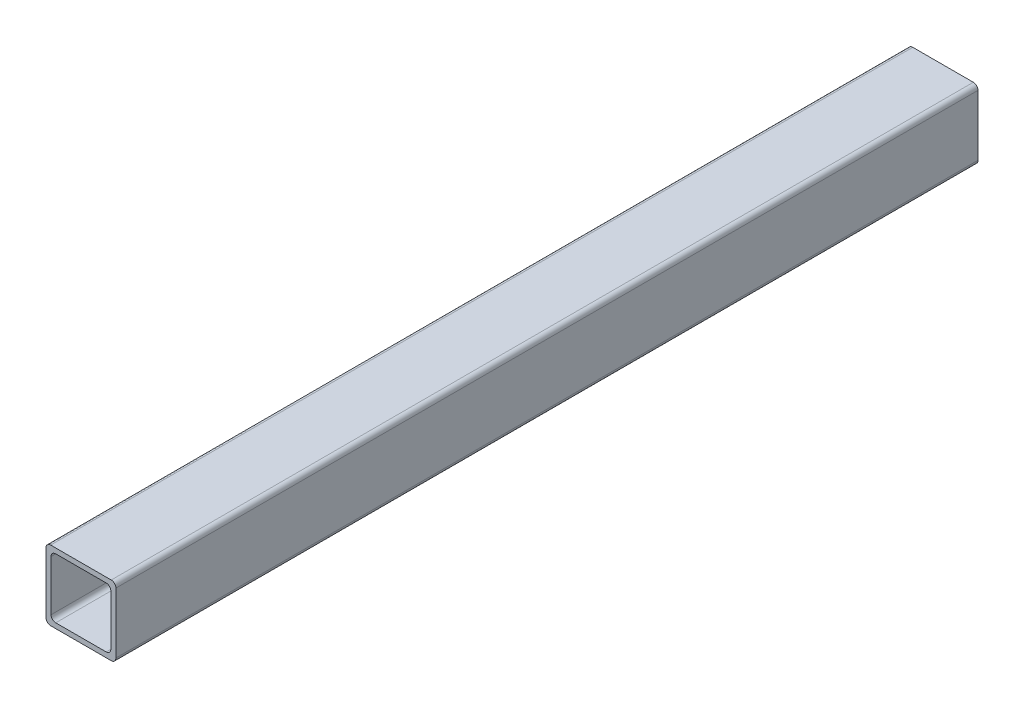
ISO-10303-21;
HEADER;
FILE_DESCRIPTION(('STEP AP214'),'2;1');
FILE_NAME('part.step','',(''),(''),'','','');
FILE_SCHEMA(('AUTOMOTIVE_DESIGN { 1 0 10303 214 1 1 1 1 }'));
ENDSEC;
DATA;
#1=APPLICATION_CONTEXT('core data for automotive mechanical design processes');
#2=APPLICATION_PROTOCOL_DEFINITION('international standard','automotive_design',2000,#1);
#3=PRODUCT_CONTEXT('',#1,'mechanical');
#4=PRODUCT('Part','Part','',(#3));
#5=PRODUCT_RELATED_PRODUCT_CATEGORY('part','',(#4));
#6=PRODUCT_DEFINITION_FORMATION('','',#4);
#7=PRODUCT_DEFINITION_CONTEXT('part definition',#1,'design');
#8=PRODUCT_DEFINITION('design','',#6,#7);
#9=PRODUCT_DEFINITION_SHAPE('','',#8);
#10=(LENGTH_UNIT() NAMED_UNIT(*) SI_UNIT(.MILLI.,.METRE.));
#11=(NAMED_UNIT(*) PLANE_ANGLE_UNIT() SI_UNIT($,.RADIAN.));
#12=(NAMED_UNIT(*) SI_UNIT($,.STERADIAN.) SOLID_ANGLE_UNIT());
#13=UNCERTAINTY_MEASURE_WITH_UNIT(LENGTH_MEASURE(1.E-05),#10,'distance_accuracy_value','');
#14=(GEOMETRIC_REPRESENTATION_CONTEXT(3) GLOBAL_UNCERTAINTY_ASSIGNED_CONTEXT((#13)) GLOBAL_UNIT_ASSIGNED_CONTEXT((#10,
#11,#12)) REPRESENTATION_CONTEXT('',''));
#15=CARTESIAN_POINT('',(0.,0.,0.));
#16=DIRECTION('',(0.,0.,1.));
#17=DIRECTION('',(1.,0.,0.));
#18=AXIS2_PLACEMENT_3D('',#15,#16,#17);
#19=CARTESIAN_POINT('',(2.54,-35.56,470.));
#20=DIRECTION('',(0.,0.,1.));
#21=DIRECTION('',(1.,0.,0.));
#22=AXIS2_PLACEMENT_3D('',#19,#20,#21);
#23=PLANE('',#22);
#24=CARTESIAN_POINT('',(2.54,-35.56,470.));
#25=DIRECTION('',(0.,0.,1.));
#26=DIRECTION('',(1.,0.,0.));
#27=AXIS2_PLACEMENT_3D('',#24,#25,#26);
#28=CIRCLE('',#27,2.54);
#29=CARTESIAN_POINT('',(0.,-35.56,470.));
#30=VERTEX_POINT('',#29);
#31=CARTESIAN_POINT('',(2.54000000000002,-38.1,470.));
#32=VERTEX_POINT('',#31);
#33=EDGE_CURVE('E211',#30,#32,#28,.T.);
#34=ORIENTED_EDGE('',*,*,#33,.T.);
#35=DIRECTION('',(1.,0.,0.));
#36=VECTOR('',#35,1.);
#37=CARTESIAN_POINT('',(2.54000000000002,-38.1,470.));
#38=LINE('',#37,#36);
#39=CARTESIAN_POINT('',(35.56,-38.1,470.));
#40=VERTEX_POINT('',#39);
#41=EDGE_CURVE('E214',#32,#40,#38,.T.);
#42=ORIENTED_EDGE('',*,*,#41,.T.);
#43=CARTESIAN_POINT('',(35.56,-35.56,470.));
#44=DIRECTION('',(0.,0.,1.));
#45=DIRECTION('',(-1.,0.,0.));
#46=AXIS2_PLACEMENT_3D('',#43,#44,#45);
#47=CIRCLE('',#46,2.54);
#48=CARTESIAN_POINT('',(38.1,-35.56,470.));
#49=VERTEX_POINT('',#48);
#50=EDGE_CURVE('E217',#40,#49,#47,.T.);
#51=ORIENTED_EDGE('',*,*,#50,.T.);
#52=DIRECTION('',(0.,1.,0.));
#53=VECTOR('',#52,1.);
#54=CARTESIAN_POINT('',(38.1,-2.54000000000002,470.));
#55=LINE('',#54,#53);
#56=CARTESIAN_POINT('',(38.1,-2.54000000000002,470.));
#57=VERTEX_POINT('',#56);
#58=EDGE_CURVE('E219',#49,#57,#55,.T.);
#59=ORIENTED_EDGE('',*,*,#58,.T.);
#60=CARTESIAN_POINT('',(35.56,-2.54,470.));
#61=DIRECTION('',(0.,0.,1.));
#62=DIRECTION('',(1.,0.,0.));
#63=AXIS2_PLACEMENT_3D('',#60,#61,#62);
#64=CIRCLE('',#63,2.54);
#65=CARTESIAN_POINT('',(35.56,0.,470.));
#66=VERTEX_POINT('',#65);
#67=EDGE_CURVE('E221',#57,#66,#64,.T.);
#68=ORIENTED_EDGE('',*,*,#67,.T.);
#69=DIRECTION('',(-1.,0.,0.));
#70=VECTOR('',#69,1.);
#71=CARTESIAN_POINT('',(2.54000000000002,0.,470.));
#72=LINE('',#71,#70);
#73=CARTESIAN_POINT('',(2.54000000000002,0.,470.));
#74=VERTEX_POINT('',#73);
#75=EDGE_CURVE('E223',#66,#74,#72,.T.);
#76=ORIENTED_EDGE('',*,*,#75,.T.);
#77=CARTESIAN_POINT('',(2.54,-2.54,470.));
#78=DIRECTION('',(0.,0.,1.));
#79=DIRECTION('',(-1.,0.,0.));
#80=AXIS2_PLACEMENT_3D('',#77,#78,#79);
#81=CIRCLE('',#80,2.54);
#82=CARTESIAN_POINT('',(0.,-2.54000000000002,470.));
#83=VERTEX_POINT('',#82);
#84=EDGE_CURVE('E225',#74,#83,#81,.T.);
#85=ORIENTED_EDGE('',*,*,#84,.T.);
#86=DIRECTION('',(0.,-1.,0.));
#87=VECTOR('',#86,1.);
#88=CARTESIAN_POINT('',(0.,-2.54000000000002,470.));
#89=LINE('',#88,#87);
#90=EDGE_CURVE('E227',#83,#30,#89,.T.);
#91=ORIENTED_EDGE('',*,*,#90,.T.);
#92=EDGE_LOOP('',(#34,#42,#51,#59,#68,#76,#85,#91));
#93=FACE_BOUND('',#92,.T.);
#94=DIRECTION('',(1.,0.,0.));
#95=VECTOR('',#94,1.);
#96=CARTESIAN_POINT('',(5.30860000000002,-35.3314,470.));
#97=LINE('',#96,#95);
#98=CARTESIAN_POINT('',(5.30860000000002,-35.3314,470.));
#99=VERTEX_POINT('',#98);
#100=CARTESIAN_POINT('',(32.7914,-35.3314,470.));
#101=VERTEX_POINT('',#100);
#102=EDGE_CURVE('E154',#99,#101,#97,.T.);
#103=ORIENTED_EDGE('',*,*,#102,.F.);
#104=CARTESIAN_POINT('',(5.3086,-32.7914,470.));
#105=DIRECTION('',(0.,0.,1.));
#106=DIRECTION('',(1.,0.,0.));
#107=AXIS2_PLACEMENT_3D('',#104,#105,#106);
#108=CIRCLE('',#107,2.54);
#109=CARTESIAN_POINT('',(2.7686,-32.7914,470.));
#110=VERTEX_POINT('',#109);
#111=EDGE_CURVE('E146',#110,#99,#108,.T.);
#112=ORIENTED_EDGE('',*,*,#111,.F.);
#113=DIRECTION('',(0.,-1.,0.));
#114=VECTOR('',#113,1.);
#115=CARTESIAN_POINT('',(2.7686,-5.30860000000002,470.));
#116=LINE('',#115,#114);
#117=CARTESIAN_POINT('',(2.7686,-5.30860000000002,470.));
#118=VERTEX_POINT('',#117);
#119=EDGE_CURVE('E179',#118,#110,#116,.T.);
#120=ORIENTED_EDGE('',*,*,#119,.F.);
#121=CARTESIAN_POINT('',(5.3086,-5.3086,470.));
#122=DIRECTION('',(0.,0.,1.));
#123=DIRECTION('',(1.,0.,0.));
#124=AXIS2_PLACEMENT_3D('',#121,#122,#123);
#125=CIRCLE('',#124,2.54);
#126=CARTESIAN_POINT('',(5.30860000000002,-2.7686,470.));
#127=VERTEX_POINT('',#126);
#128=EDGE_CURVE('E177',#127,#118,#125,.T.);
#129=ORIENTED_EDGE('',*,*,#128,.F.);
#130=DIRECTION('',(-1.,0.,0.));
#131=VECTOR('',#130,1.);
#132=CARTESIAN_POINT('',(5.30860000000002,-2.7686,470.));
#133=LINE('',#132,#131);
#134=CARTESIAN_POINT('',(32.7914,-2.7686,470.));
#135=VERTEX_POINT('',#134);
#136=EDGE_CURVE('E175',#135,#127,#133,.T.);
#137=ORIENTED_EDGE('',*,*,#136,.F.);
#138=CARTESIAN_POINT('',(32.7914,-5.3086,470.));
#139=DIRECTION('',(0.,0.,1.));
#140=DIRECTION('',(1.,0.,0.));
#141=AXIS2_PLACEMENT_3D('',#138,#139,#140);
#142=CIRCLE('',#141,2.54);
#143=CARTESIAN_POINT('',(35.3314,-5.30860000000002,470.));
#144=VERTEX_POINT('',#143);
#145=EDGE_CURVE('E173',#144,#135,#142,.T.);
#146=ORIENTED_EDGE('',*,*,#145,.F.);
#147=DIRECTION('',(0.,1.,0.));
#148=VECTOR('',#147,1.);
#149=CARTESIAN_POINT('',(35.3314,-5.30860000000002,470.));
#150=LINE('',#149,#148);
#151=CARTESIAN_POINT('',(35.3314,-32.7914,470.));
#152=VERTEX_POINT('',#151);
#153=EDGE_CURVE('E169',#152,#144,#150,.T.);
#154=ORIENTED_EDGE('',*,*,#153,.F.);
#155=CARTESIAN_POINT('',(32.7914,-32.7914,470.));
#156=DIRECTION('',(0.,0.,1.));
#157=DIRECTION('',(1.,0.,0.));
#158=AXIS2_PLACEMENT_3D('',#155,#156,#157);
#159=CIRCLE('',#158,2.54);
#160=EDGE_CURVE('E167',#101,#152,#159,.T.);
#161=ORIENTED_EDGE('',*,*,#160,.F.);
#162=EDGE_LOOP('',(#103,#112,#120,#129,#137,#146,#154,#161));
#163=FACE_BOUND('',#162,.T.);
#164=ADVANCED_FACE('F33',(#93,#163),#23,.T.);
#165=CARTESIAN_POINT('',(2.54,-35.56,0.));
#166=DIRECTION('',(0.,0.,1.));
#167=DIRECTION('',(1.,0.,0.));
#168=AXIS2_PLACEMENT_3D('',#165,#166,#167);
#169=PLANE('',#168);
#170=CARTESIAN_POINT('',(2.54,-35.56,0.));
#171=DIRECTION('',(0.,0.,1.));
#172=DIRECTION('',(1.,0.,0.));
#173=AXIS2_PLACEMENT_3D('',#170,#171,#172);
#174=CIRCLE('',#173,2.54);
#175=CARTESIAN_POINT('',(0.,-35.56,0.));
#176=VERTEX_POINT('',#175);
#177=CARTESIAN_POINT('',(2.54000000000002,-38.1,0.));
#178=VERTEX_POINT('',#177);
#179=EDGE_CURVE('E162',#176,#178,#174,.T.);
#180=ORIENTED_EDGE('',*,*,#179,.F.);
#181=DIRECTION('',(0.,-1.,0.));
#182=VECTOR('',#181,1.);
#183=CARTESIAN_POINT('',(0.,-2.54000000000002,0.));
#184=LINE('',#183,#182);
#185=CARTESIAN_POINT('',(0.,-2.54000000000002,0.));
#186=VERTEX_POINT('',#185);
#187=EDGE_CURVE('E215',#186,#176,#184,.T.);
#188=ORIENTED_EDGE('',*,*,#187,.F.);
#189=CARTESIAN_POINT('',(2.54,-2.54,0.));
#190=DIRECTION('',(0.,0.,1.));
#191=DIRECTION('',(-1.,0.,0.));
#192=AXIS2_PLACEMENT_3D('',#189,#190,#191);
#193=CIRCLE('',#192,2.54);
#194=CARTESIAN_POINT('',(2.54000000000002,0.,0.));
#195=VERTEX_POINT('',#194);
#196=EDGE_CURVE('E242',#195,#186,#193,.T.);
#197=ORIENTED_EDGE('',*,*,#196,.F.);
#198=DIRECTION('',(-1.,0.,0.));
#199=VECTOR('',#198,1.);
#200=CARTESIAN_POINT('',(2.54000000000002,0.,0.));
#201=LINE('',#200,#199);
#202=CARTESIAN_POINT('',(35.56,0.,0.));
#203=VERTEX_POINT('',#202);
#204=EDGE_CURVE('E240',#203,#195,#201,.T.);
#205=ORIENTED_EDGE('',*,*,#204,.F.);
#206=CARTESIAN_POINT('',(35.56,-2.54,0.));
#207=DIRECTION('',(0.,0.,1.));
#208=DIRECTION('',(1.,0.,0.));
#209=AXIS2_PLACEMENT_3D('',#206,#207,#208);
#210=CIRCLE('',#209,2.54);
#211=CARTESIAN_POINT('',(38.1,-2.54000000000002,0.));
#212=VERTEX_POINT('',#211);
#213=EDGE_CURVE('E238',#212,#203,#210,.T.);
#214=ORIENTED_EDGE('',*,*,#213,.F.);
#215=DIRECTION('',(0.,1.,0.));
#216=VECTOR('',#215,1.);
#217=CARTESIAN_POINT('',(38.1,-2.54000000000002,0.));
#218=LINE('',#217,#216);
#219=CARTESIAN_POINT('',(38.1,-35.56,0.));
#220=VERTEX_POINT('',#219);
#221=EDGE_CURVE('E236',#220,#212,#218,.T.);
#222=ORIENTED_EDGE('',*,*,#221,.F.);
#223=CARTESIAN_POINT('',(35.56,-35.56,0.));
#224=DIRECTION('',(0.,0.,1.));
#225=DIRECTION('',(-1.,0.,0.));
#226=AXIS2_PLACEMENT_3D('',#223,#224,#225);
#227=CIRCLE('',#226,2.54);
#228=CARTESIAN_POINT('',(35.56,-38.1,0.));
#229=VERTEX_POINT('',#228);
#230=EDGE_CURVE('E234',#229,#220,#227,.T.);
#231=ORIENTED_EDGE('',*,*,#230,.F.);
#232=DIRECTION('',(1.,0.,0.));
#233=VECTOR('',#232,1.);
#234=CARTESIAN_POINT('',(2.54000000000002,-38.1,0.));
#235=LINE('',#234,#233);
#236=EDGE_CURVE('E232',#178,#229,#235,.T.);
#237=ORIENTED_EDGE('',*,*,#236,.F.);
#238=EDGE_LOOP('',(#180,#188,#197,#205,#214,#222,#231,#237));
#239=FACE_BOUND('',#238,.T.);
#240=CARTESIAN_POINT('',(5.3086,-32.7914,0.));
#241=DIRECTION('',(0.,0.,1.));
#242=DIRECTION('',(1.,0.,0.));
#243=AXIS2_PLACEMENT_3D('',#240,#241,#242);
#244=CIRCLE('',#243,2.54);
#245=CARTESIAN_POINT('',(2.7686,-32.7914,0.));
#246=VERTEX_POINT('',#245);
#247=CARTESIAN_POINT('',(5.30860000000002,-35.3314,0.));
#248=VERTEX_POINT('',#247);
#249=EDGE_CURVE('E56',#246,#248,#244,.T.);
#250=ORIENTED_EDGE('',*,*,#249,.T.);
#251=DIRECTION('',(1.,0.,0.));
#252=VECTOR('',#251,1.);
#253=CARTESIAN_POINT('',(5.30860000000002,-35.3314,0.));
#254=LINE('',#253,#252);
#255=CARTESIAN_POINT('',(32.7914,-35.3314,0.));
#256=VERTEX_POINT('',#255);
#257=EDGE_CURVE('E161',#248,#256,#254,.T.);
#258=ORIENTED_EDGE('',*,*,#257,.T.);
#259=CARTESIAN_POINT('',(32.7914,-32.7914,0.));
#260=DIRECTION('',(0.,0.,1.));
#261=DIRECTION('',(1.,0.,0.));
#262=AXIS2_PLACEMENT_3D('',#259,#260,#261);
#263=CIRCLE('',#262,2.54);
#264=CARTESIAN_POINT('',(35.3314,-32.7914,0.));
#265=VERTEX_POINT('',#264);
#266=EDGE_CURVE('E183',#256,#265,#263,.T.);
#267=ORIENTED_EDGE('',*,*,#266,.T.);
#268=DIRECTION('',(0.,1.,0.));
#269=VECTOR('',#268,1.);
#270=CARTESIAN_POINT('',(35.3314,-5.30860000000002,0.));
#271=LINE('',#270,#269);
#272=CARTESIAN_POINT('',(35.3314,-5.30860000000002,0.));
#273=VERTEX_POINT('',#272);
#274=EDGE_CURVE('E186',#265,#273,#271,.T.);
#275=ORIENTED_EDGE('',*,*,#274,.T.);
#276=CARTESIAN_POINT('',(32.7914,-5.3086,0.));
#277=DIRECTION('',(0.,0.,1.));
#278=DIRECTION('',(1.,0.,0.));
#279=AXIS2_PLACEMENT_3D('',#276,#277,#278);
#280=CIRCLE('',#279,2.54);
#281=CARTESIAN_POINT('',(32.7914,-2.7686,0.));
#282=VERTEX_POINT('',#281);
#283=EDGE_CURVE('E189',#273,#282,#280,.T.);
#284=ORIENTED_EDGE('',*,*,#283,.T.);
#285=DIRECTION('',(-1.,0.,0.));
#286=VECTOR('',#285,1.);
#287=CARTESIAN_POINT('',(5.30860000000002,-2.7686,0.));
#288=LINE('',#287,#286);
#289=CARTESIAN_POINT('',(5.30860000000002,-2.7686,0.));
#290=VERTEX_POINT('',#289);
#291=EDGE_CURVE('E192',#282,#290,#288,.T.);
#292=ORIENTED_EDGE('',*,*,#291,.T.);
#293=CARTESIAN_POINT('',(5.3086,-5.3086,0.));
#294=DIRECTION('',(0.,0.,1.));
#295=DIRECTION('',(1.,0.,0.));
#296=AXIS2_PLACEMENT_3D('',#293,#294,#295);
#297=CIRCLE('',#296,2.54);
#298=CARTESIAN_POINT('',(2.7686,-5.30860000000002,0.));
#299=VERTEX_POINT('',#298);
#300=EDGE_CURVE('E195',#290,#299,#297,.T.);
#301=ORIENTED_EDGE('',*,*,#300,.T.);
#302=DIRECTION('',(0.,-1.,0.));
#303=VECTOR('',#302,1.);
#304=CARTESIAN_POINT('',(2.7686,-5.30860000000002,0.));
#305=LINE('',#304,#303);
#306=EDGE_CURVE('E155',#299,#246,#305,.T.);
#307=ORIENTED_EDGE('',*,*,#306,.T.);
#308=EDGE_LOOP('',(#250,#258,#267,#275,#284,#292,#301,#307));
#309=FACE_BOUND('',#308,.T.);
#310=ADVANCED_FACE('F272',(#239,#309),#169,.F.);
#311=CARTESIAN_POINT('',(2.54,-35.56,470.));
#312=DIRECTION('',(0.,0.,-1.));
#313=DIRECTION('',(-1.,0.,0.));
#314=AXIS2_PLACEMENT_3D('',#311,#312,#313);
#315=CYLINDRICAL_SURFACE('',#314,2.54);
#316=ORIENTED_EDGE('',*,*,#179,.T.);
#317=DIRECTION('',(0.,0.,-1.));
#318=VECTOR('',#317,1.);
#319=CARTESIAN_POINT('',(2.54000000000002,-38.1,470.));
#320=LINE('',#319,#318);
#321=EDGE_CURVE('E11',#32,#178,#320,.T.);
#322=ORIENTED_EDGE('',*,*,#321,.F.);
#323=ORIENTED_EDGE('',*,*,#33,.F.);
#324=DIRECTION('',(0.,0.,-1.));
#325=VECTOR('',#324,1.);
#326=CARTESIAN_POINT('',(0.,-35.56,470.));
#327=LINE('',#326,#325);
#328=EDGE_CURVE('E229',#30,#176,#327,.T.);
#329=ORIENTED_EDGE('',*,*,#328,.T.);
#330=EDGE_LOOP('',(#316,#322,#323,#329));
#331=FACE_BOUND('',#330,.T.);
#332=ADVANCED_FACE('F35',(#331),#315,.T.);
#333=CARTESIAN_POINT('',(2.54000000000002,-38.1,470.));
#334=DIRECTION('',(0.,1.,0.));
#335=DIRECTION('',(0.,0.,1.));
#336=AXIS2_PLACEMENT_3D('',#333,#334,#335);
#337=PLANE('',#336);
#338=ORIENTED_EDGE('',*,*,#236,.T.);
#339=DIRECTION('',(0.,0.,-1.));
#340=VECTOR('',#339,1.);
#341=CARTESIAN_POINT('',(35.56,-38.1,470.));
#342=LINE('',#341,#340);
#343=EDGE_CURVE('E41',#40,#229,#342,.T.);
#344=ORIENTED_EDGE('',*,*,#343,.F.);
#345=ORIENTED_EDGE('',*,*,#41,.F.);
#346=ORIENTED_EDGE('',*,*,#321,.T.);
#347=EDGE_LOOP('',(#338,#344,#345,#346));
#348=FACE_BOUND('',#347,.T.);
#349=ADVANCED_FACE('F289',(#348),#337,.F.);
#350=CARTESIAN_POINT('',(35.56,-35.56,470.));
#351=DIRECTION('',(0.,0.,-1.));
#352=DIRECTION('',(-1.,0.,0.));
#353=AXIS2_PLACEMENT_3D('',#350,#351,#352);
#354=CYLINDRICAL_SURFACE('',#353,2.54);
#355=ORIENTED_EDGE('',*,*,#230,.T.);
#356=DIRECTION('',(0.,0.,-1.));
#357=VECTOR('',#356,1.);
#358=CARTESIAN_POINT('',(38.1,-35.56,470.));
#359=LINE('',#358,#357);
#360=EDGE_CURVE('E259',#49,#220,#359,.T.);
#361=ORIENTED_EDGE('',*,*,#360,.F.);
#362=ORIENTED_EDGE('',*,*,#50,.F.);
#363=ORIENTED_EDGE('',*,*,#343,.T.);
#364=EDGE_LOOP('',(#355,#361,#362,#363));
#365=FACE_BOUND('',#364,.T.);
#366=ADVANCED_FACE('F266',(#365),#354,.T.);
#367=CARTESIAN_POINT('',(38.1,-2.54000000000002,470.));
#368=DIRECTION('',(-1.,0.,0.));
#369=DIRECTION('',(0.,-1.,0.));
#370=AXIS2_PLACEMENT_3D('',#367,#368,#369);
#371=PLANE('',#370);
#372=ORIENTED_EDGE('',*,*,#221,.T.);
#373=DIRECTION('',(0.,0.,-1.));
#374=VECTOR('',#373,1.);
#375=CARTESIAN_POINT('',(38.1,-2.54000000000002,470.));
#376=LINE('',#375,#374);
#377=EDGE_CURVE('E256',#57,#212,#376,.T.);
#378=ORIENTED_EDGE('',*,*,#377,.F.);
#379=ORIENTED_EDGE('',*,*,#58,.F.);
#380=ORIENTED_EDGE('',*,*,#360,.T.);
#381=EDGE_LOOP('',(#372,#378,#379,#380));
#382=FACE_BOUND('',#381,.T.);
#383=ADVANCED_FACE('F278',(#382),#371,.F.);
#384=CARTESIAN_POINT('',(35.56,-2.54,470.));
#385=DIRECTION('',(0.,0.,-1.));
#386=DIRECTION('',(-1.,0.,0.));
#387=AXIS2_PLACEMENT_3D('',#384,#385,#386);
#388=CYLINDRICAL_SURFACE('',#387,2.54);
#389=ORIENTED_EDGE('',*,*,#213,.T.);
#390=DIRECTION('',(0.,0.,-1.));
#391=VECTOR('',#390,1.);
#392=CARTESIAN_POINT('',(35.56,0.,470.));
#393=LINE('',#392,#391);
#394=EDGE_CURVE('E253',#66,#203,#393,.T.);
#395=ORIENTED_EDGE('',*,*,#394,.F.);
#396=ORIENTED_EDGE('',*,*,#67,.F.);
#397=ORIENTED_EDGE('',*,*,#377,.T.);
#398=EDGE_LOOP('',(#389,#395,#396,#397));
#399=FACE_BOUND('',#398,.T.);
#400=ADVANCED_FACE('F282',(#399),#388,.T.);
#401=CARTESIAN_POINT('',(2.54000000000002,0.,470.));
#402=DIRECTION('',(0.,-1.,0.));
#403=DIRECTION('',(0.,0.,-1.));
#404=AXIS2_PLACEMENT_3D('',#401,#402,#403);
#405=PLANE('',#404);
#406=ORIENTED_EDGE('',*,*,#204,.T.);
#407=DIRECTION('',(0.,0.,-1.));
#408=VECTOR('',#407,1.);
#409=CARTESIAN_POINT('',(2.54000000000002,0.,470.));
#410=LINE('',#409,#408);
#411=EDGE_CURVE('E250',#74,#195,#410,.T.);
#412=ORIENTED_EDGE('',*,*,#411,.F.);
#413=ORIENTED_EDGE('',*,*,#75,.F.);
#414=ORIENTED_EDGE('',*,*,#394,.T.);
#415=EDGE_LOOP('',(#406,#412,#413,#414));
#416=FACE_BOUND('',#415,.T.);
#417=ADVANCED_FACE('F302',(#416),#405,.F.);
#418=CARTESIAN_POINT('',(2.54,-2.54,470.));
#419=DIRECTION('',(0.,0.,-1.));
#420=DIRECTION('',(-1.,0.,0.));
#421=AXIS2_PLACEMENT_3D('',#418,#419,#420);
#422=CYLINDRICAL_SURFACE('',#421,2.54);
#423=ORIENTED_EDGE('',*,*,#196,.T.);
#424=DIRECTION('',(0.,0.,-1.));
#425=VECTOR('',#424,1.);
#426=CARTESIAN_POINT('',(0.,-2.54000000000002,470.));
#427=LINE('',#426,#425);
#428=EDGE_CURVE('E247',#83,#186,#427,.T.);
#429=ORIENTED_EDGE('',*,*,#428,.F.);
#430=ORIENTED_EDGE('',*,*,#84,.F.);
#431=ORIENTED_EDGE('',*,*,#411,.T.);
#432=EDGE_LOOP('',(#423,#429,#430,#431));
#433=FACE_BOUND('',#432,.T.);
#434=ADVANCED_FACE('F300',(#433),#422,.T.);
#435=CARTESIAN_POINT('',(0.,-2.54000000000002,470.));
#436=DIRECTION('',(1.,0.,0.));
#437=DIRECTION('',(0.,1.,0.));
#438=AXIS2_PLACEMENT_3D('',#435,#436,#437);
#439=PLANE('',#438);
#440=ORIENTED_EDGE('',*,*,#187,.T.);
#441=ORIENTED_EDGE('',*,*,#328,.F.);
#442=ORIENTED_EDGE('',*,*,#90,.F.);
#443=ORIENTED_EDGE('',*,*,#428,.T.);
#444=EDGE_LOOP('',(#440,#441,#442,#443));
#445=FACE_BOUND('',#444,.T.);
#446=ADVANCED_FACE('F295',(#445),#439,.F.);
#447=CARTESIAN_POINT('',(5.3086,-32.7914,470.));
#448=DIRECTION('',(0.,0.,-1.));
#449=DIRECTION('',(-1.,0.,0.));
#450=AXIS2_PLACEMENT_3D('',#447,#448,#449);
#451=CYLINDRICAL_SURFACE('',#450,2.54);
#452=ORIENTED_EDGE('',*,*,#249,.F.);
#453=DIRECTION('',(0.,0.,-1.));
#454=VECTOR('',#453,1.);
#455=CARTESIAN_POINT('',(2.7686,-32.7914,470.));
#456=LINE('',#455,#454);
#457=EDGE_CURVE('E150',#110,#246,#456,.T.);
#458=ORIENTED_EDGE('',*,*,#457,.F.);
#459=ORIENTED_EDGE('',*,*,#111,.T.);
#460=DIRECTION('',(0.,0.,-1.));
#461=VECTOR('',#460,1.);
#462=CARTESIAN_POINT('',(5.30860000000002,-35.3314,470.));
#463=LINE('',#462,#461);
#464=EDGE_CURVE('E149',#99,#248,#463,.T.);
#465=ORIENTED_EDGE('',*,*,#464,.T.);
#466=EDGE_LOOP('',(#452,#458,#459,#465));
#467=FACE_BOUND('',#466,.T.);
#468=ADVANCED_FACE('F148',(#467),#451,.F.);
#469=CARTESIAN_POINT('',(5.30860000000002,-35.3314,470.));
#470=DIRECTION('',(0.,1.,0.));
#471=DIRECTION('',(0.,0.,1.));
#472=AXIS2_PLACEMENT_3D('',#469,#470,#471);
#473=PLANE('',#472);
#474=ORIENTED_EDGE('',*,*,#257,.F.);
#475=ORIENTED_EDGE('',*,*,#464,.F.);
#476=ORIENTED_EDGE('',*,*,#102,.T.);
#477=DIRECTION('',(0.,0.,-1.));
#478=VECTOR('',#477,1.);
#479=CARTESIAN_POINT('',(32.7914,-35.3314,470.));
#480=LINE('',#479,#478);
#481=EDGE_CURVE('E163',#101,#256,#480,.T.);
#482=ORIENTED_EDGE('',*,*,#481,.T.);
#483=EDGE_LOOP('',(#474,#475,#476,#482));
#484=FACE_BOUND('',#483,.T.);
#485=ADVANCED_FACE('F158',(#484),#473,.T.);
#486=CARTESIAN_POINT('',(32.7914,-32.7914,470.));
#487=DIRECTION('',(0.,0.,-1.));
#488=DIRECTION('',(-1.,0.,0.));
#489=AXIS2_PLACEMENT_3D('',#486,#487,#488);
#490=CYLINDRICAL_SURFACE('',#489,2.54);
#491=ORIENTED_EDGE('',*,*,#266,.F.);
#492=ORIENTED_EDGE('',*,*,#481,.F.);
#493=ORIENTED_EDGE('',*,*,#160,.T.);
#494=DIRECTION('',(0.,0.,-1.));
#495=VECTOR('',#494,1.);
#496=CARTESIAN_POINT('',(35.3314,-32.7914,470.));
#497=LINE('',#496,#495);
#498=EDGE_CURVE('E208',#152,#265,#497,.T.);
#499=ORIENTED_EDGE('',*,*,#498,.T.);
#500=EDGE_LOOP('',(#491,#492,#493,#499));
#501=FACE_BOUND('',#500,.T.);
#502=ADVANCED_FACE('F327',(#501),#490,.F.);
#503=CARTESIAN_POINT('',(35.3314,-5.30860000000002,470.));
#504=DIRECTION('',(-1.,0.,0.));
#505=DIRECTION('',(0.,0.,1.));
#506=AXIS2_PLACEMENT_3D('',#503,#504,#505);
#507=PLANE('',#506);
#508=ORIENTED_EDGE('',*,*,#274,.F.);
#509=ORIENTED_EDGE('',*,*,#498,.F.);
#510=ORIENTED_EDGE('',*,*,#153,.T.);
#511=DIRECTION('',(0.,0.,-1.));
#512=VECTOR('',#511,1.);
#513=CARTESIAN_POINT('',(35.3314,-5.30860000000002,470.));
#514=LINE('',#513,#512);
#515=EDGE_CURVE('E206',#144,#273,#514,.T.);
#516=ORIENTED_EDGE('',*,*,#515,.T.);
#517=EDGE_LOOP('',(#508,#509,#510,#516));
#518=FACE_BOUND('',#517,.T.);
#519=ADVANCED_FACE('F331',(#518),#507,.T.);
#520=CARTESIAN_POINT('',(32.7914,-5.3086,470.));
#521=DIRECTION('',(0.,0.,-1.));
#522=DIRECTION('',(-1.,0.,0.));
#523=AXIS2_PLACEMENT_3D('',#520,#521,#522);
#524=CYLINDRICAL_SURFACE('',#523,2.54);
#525=ORIENTED_EDGE('',*,*,#283,.F.);
#526=ORIENTED_EDGE('',*,*,#515,.F.);
#527=ORIENTED_EDGE('',*,*,#145,.T.);
#528=DIRECTION('',(0.,0.,-1.));
#529=VECTOR('',#528,1.);
#530=CARTESIAN_POINT('',(32.7914,-2.7686,470.));
#531=LINE('',#530,#529);
#532=EDGE_CURVE('E204',#135,#282,#531,.T.);
#533=ORIENTED_EDGE('',*,*,#532,.T.);
#534=EDGE_LOOP('',(#525,#526,#527,#533));
#535=FACE_BOUND('',#534,.T.);
#536=ADVANCED_FACE('F337',(#535),#524,.F.);
#537=CARTESIAN_POINT('',(5.30860000000002,-2.7686,470.));
#538=DIRECTION('',(0.,-1.,0.));
#539=DIRECTION('',(0.,0.,-1.));
#540=AXIS2_PLACEMENT_3D('',#537,#538,#539);
#541=PLANE('',#540);
#542=ORIENTED_EDGE('',*,*,#291,.F.);
#543=ORIENTED_EDGE('',*,*,#532,.F.);
#544=ORIENTED_EDGE('',*,*,#136,.T.);
#545=DIRECTION('',(0.,0.,-1.));
#546=VECTOR('',#545,1.);
#547=CARTESIAN_POINT('',(5.30860000000002,-2.7686,470.));
#548=LINE('',#547,#546);
#549=EDGE_CURVE('E202',#127,#290,#548,.T.);
#550=ORIENTED_EDGE('',*,*,#549,.T.);
#551=EDGE_LOOP('',(#542,#543,#544,#550));
#552=FACE_BOUND('',#551,.T.);
#553=ADVANCED_FACE('F341',(#552),#541,.T.);
#554=CARTESIAN_POINT('',(5.3086,-5.3086,470.));
#555=DIRECTION('',(0.,0.,-1.));
#556=DIRECTION('',(-1.,0.,0.));
#557=AXIS2_PLACEMENT_3D('',#554,#555,#556);
#558=CYLINDRICAL_SURFACE('',#557,2.54);
#559=ORIENTED_EDGE('',*,*,#300,.F.);
#560=ORIENTED_EDGE('',*,*,#549,.F.);
#561=ORIENTED_EDGE('',*,*,#128,.T.);
#562=DIRECTION('',(0.,0.,-1.));
#563=VECTOR('',#562,1.);
#564=CARTESIAN_POINT('',(2.7686,-5.30860000000002,470.));
#565=LINE('',#564,#563);
#566=EDGE_CURVE('E48',#118,#299,#565,.T.);
#567=ORIENTED_EDGE('',*,*,#566,.T.);
#568=EDGE_LOOP('',(#559,#560,#561,#567));
#569=FACE_BOUND('',#568,.T.);
#570=ADVANCED_FACE('F345',(#569),#558,.F.);
#571=CARTESIAN_POINT('',(2.7686,-5.30860000000002,470.));
#572=DIRECTION('',(1.,0.,0.));
#573=DIRECTION('',(0.,0.,-1.));
#574=AXIS2_PLACEMENT_3D('',#571,#572,#573);
#575=PLANE('',#574);
#576=ORIENTED_EDGE('',*,*,#306,.F.);
#577=ORIENTED_EDGE('',*,*,#566,.F.);
#578=ORIENTED_EDGE('',*,*,#119,.T.);
#579=ORIENTED_EDGE('',*,*,#457,.T.);
#580=EDGE_LOOP('',(#576,#577,#578,#579));
#581=FACE_BOUND('',#580,.T.);
#582=ADVANCED_FACE('F349',(#581),#575,.T.);
#583=CLOSED_SHELL('',(#164,#310,#332,#349,#366,#383,#400,#417,#434,#446,#468,#485,#502,#519,
#536,#553,#570,#582));
#584=MANIFOLD_SOLID_BREP('B2',#583);
#585=ADVANCED_BREP_SHAPE_REPRESENTATION('',(#18,#584),#14);
#586=SHAPE_DEFINITION_REPRESENTATION(#9,#585);
ENDSEC;
END-ISO-10303-21;
